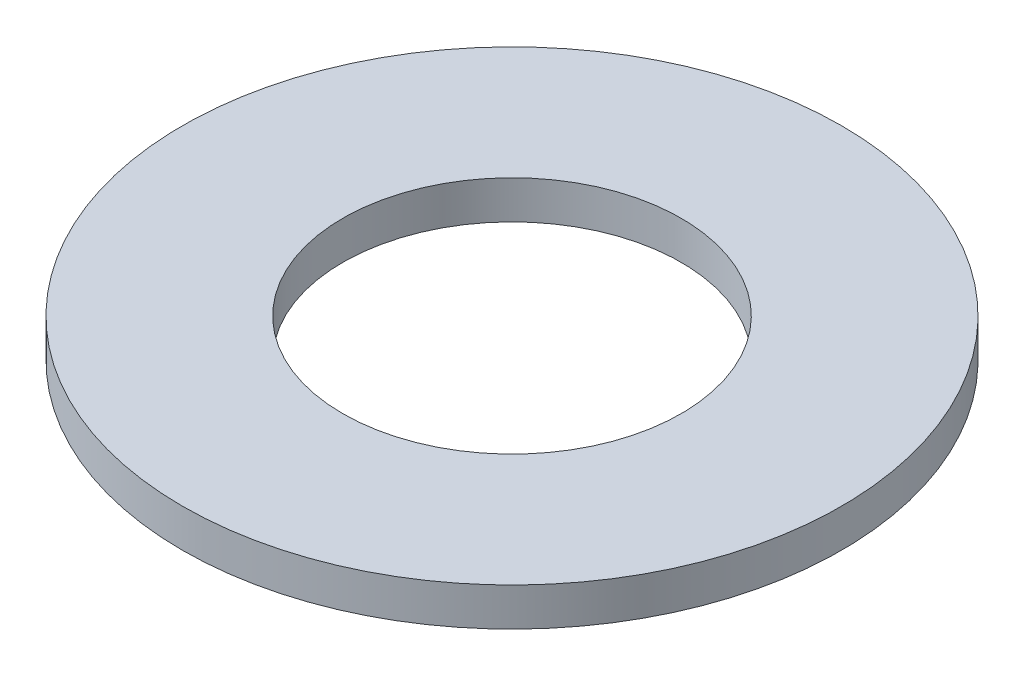
ISO-10303-21;
HEADER;
FILE_DESCRIPTION(('STEP AP214'),'2;1');
FILE_NAME('part.step','',(''),(''),'','','');
FILE_SCHEMA(('AUTOMOTIVE_DESIGN { 1 0 10303 214 1 1 1 1 }'));
ENDSEC;
DATA;
#1=APPLICATION_CONTEXT('core data for automotive mechanical design processes');
#2=APPLICATION_PROTOCOL_DEFINITION('international standard','automotive_design',2000,#1);
#3=PRODUCT_CONTEXT('',#1,'mechanical');
#4=PRODUCT('Part','Part','',(#3));
#5=PRODUCT_RELATED_PRODUCT_CATEGORY('part','',(#4));
#6=PRODUCT_DEFINITION_FORMATION('','',#4);
#7=PRODUCT_DEFINITION_CONTEXT('part definition',#1,'design');
#8=PRODUCT_DEFINITION('design','',#6,#7);
#9=PRODUCT_DEFINITION_SHAPE('','',#8);
#10=(LENGTH_UNIT() NAMED_UNIT(*) SI_UNIT(.MILLI.,.METRE.));
#11=(NAMED_UNIT(*) PLANE_ANGLE_UNIT() SI_UNIT($,.RADIAN.));
#12=(NAMED_UNIT(*) SI_UNIT($,.STERADIAN.) SOLID_ANGLE_UNIT());
#13=UNCERTAINTY_MEASURE_WITH_UNIT(LENGTH_MEASURE(1.E-05),#10,'distance_accuracy_value','');
#14=(GEOMETRIC_REPRESENTATION_CONTEXT(3) GLOBAL_UNCERTAINTY_ASSIGNED_CONTEXT((#13)) GLOBAL_UNIT_ASSIGNED_CONTEXT((#10,
#11,#12)) REPRESENTATION_CONTEXT('',''));
#15=CARTESIAN_POINT('',(0.,0.,0.));
#16=DIRECTION('',(0.,0.,1.));
#17=DIRECTION('',(1.,0.,0.));
#18=AXIS2_PLACEMENT_3D('',#15,#16,#17);
#19=CARTESIAN_POINT('',(0.,0.508,0.));
#20=DIRECTION('',(0.,-1.,0.));
#21=DIRECTION('',(0.,0.,-1.));
#22=AXIS2_PLACEMENT_3D('',#19,#20,#21);
#23=CYLINDRICAL_SURFACE('',#22,4.3815);
#24=CARTESIAN_POINT('',(0.,0.508,0.));
#25=DIRECTION('',(0.,1.,0.));
#26=DIRECTION('',(0.,0.,1.));
#27=AXIS2_PLACEMENT_3D('',#24,#25,#26);
#28=CIRCLE('',#27,4.3815);
#29=CARTESIAN_POINT('',(0.,0.508,4.3815));
#30=VERTEX_POINT('',#29);
#31=EDGE_CURVE('E10',#30,#30,#28,.T.);
#32=ORIENTED_EDGE('',*,*,#31,.F.);
#33=EDGE_LOOP('',(#32));
#34=FACE_BOUND('',#33,.T.);
#35=CARTESIAN_POINT('',(0.,0.,0.));
#36=DIRECTION('',(0.,1.,0.));
#37=DIRECTION('',(0.,0.,1.));
#38=AXIS2_PLACEMENT_3D('',#35,#36,#37);
#39=CIRCLE('',#38,4.3815);
#40=CARTESIAN_POINT('',(0.,0.,4.3815));
#41=VERTEX_POINT('',#40);
#42=EDGE_CURVE('E42',#41,#41,#39,.T.);
#43=ORIENTED_EDGE('',*,*,#42,.T.);
#44=EDGE_LOOP('',(#43));
#45=FACE_BOUND('',#44,.T.);
#46=ADVANCED_FACE('F39',(#34,#45),#23,.T.);
#47=CARTESIAN_POINT('',(0.,0.508,0.));
#48=DIRECTION('',(0.,1.,0.));
#49=DIRECTION('',(0.,0.,1.));
#50=AXIS2_PLACEMENT_3D('',#47,#48,#49);
#51=PLANE('',#50);
#52=CARTESIAN_POINT('',(0.,0.508,0.));
#53=DIRECTION('',(0.,1.,0.));
#54=DIRECTION('',(0.,0.,1.));
#55=AXIS2_PLACEMENT_3D('',#52,#53,#54);
#56=CIRCLE('',#55,2.25);
#57=CARTESIAN_POINT('',(0.,0.508,2.25));
#58=VERTEX_POINT('',#57);
#59=EDGE_CURVE('E53',#58,#58,#56,.T.);
#60=ORIENTED_EDGE('',*,*,#59,.F.);
#61=EDGE_LOOP('',(#60));
#62=FACE_BOUND('',#61,.T.);
#63=ORIENTED_EDGE('',*,*,#31,.T.);
#64=EDGE_LOOP('',(#63));
#65=FACE_BOUND('',#64,.T.);
#66=ADVANCED_FACE('F59',(#62,#65),#51,.T.);
#67=CARTESIAN_POINT('',(0.,0.,0.));
#68=DIRECTION('',(0.,1.,0.));
#69=DIRECTION('',(0.,0.,1.));
#70=AXIS2_PLACEMENT_3D('',#67,#68,#69);
#71=PLANE('',#70);
#72=CARTESIAN_POINT('',(0.,0.,0.));
#73=DIRECTION('',(0.,1.,0.));
#74=DIRECTION('',(0.,0.,1.));
#75=AXIS2_PLACEMENT_3D('',#72,#73,#74);
#76=CIRCLE('',#75,2.25);
#77=CARTESIAN_POINT('',(0.,0.,2.25));
#78=VERTEX_POINT('',#77);
#79=EDGE_CURVE('E49',#78,#78,#76,.T.);
#80=ORIENTED_EDGE('',*,*,#79,.T.);
#81=EDGE_LOOP('',(#80));
#82=FACE_BOUND('',#81,.T.);
#83=ORIENTED_EDGE('',*,*,#42,.F.);
#84=EDGE_LOOP('',(#83));
#85=FACE_BOUND('',#84,.T.);
#86=ADVANCED_FACE('F61',(#82,#85),#71,.F.);
#87=CARTESIAN_POINT('',(0.,0.508,0.));
#88=DIRECTION('',(0.,1.,0.));
#89=DIRECTION('',(0.,0.,1.));
#90=AXIS2_PLACEMENT_3D('',#87,#88,#89);
#91=CYLINDRICAL_SURFACE('',#90,2.25);
#92=ORIENTED_EDGE('',*,*,#79,.F.);
#93=EDGE_LOOP('',(#92));
#94=FACE_BOUND('',#93,.T.);
#95=ORIENTED_EDGE('',*,*,#59,.T.);
#96=EDGE_LOOP('',(#95));
#97=FACE_BOUND('',#96,.T.);
#98=ADVANCED_FACE('F57',(#94,#97),#91,.F.);
#99=CLOSED_SHELL('',(#46,#66,#86,#98));
#100=MANIFOLD_SOLID_BREP('B2',#99);
#101=ADVANCED_BREP_SHAPE_REPRESENTATION('',(#18,#100),#14);
#102=SHAPE_DEFINITION_REPRESENTATION(#9,#101);
ENDSEC;
END-ISO-10303-21;
